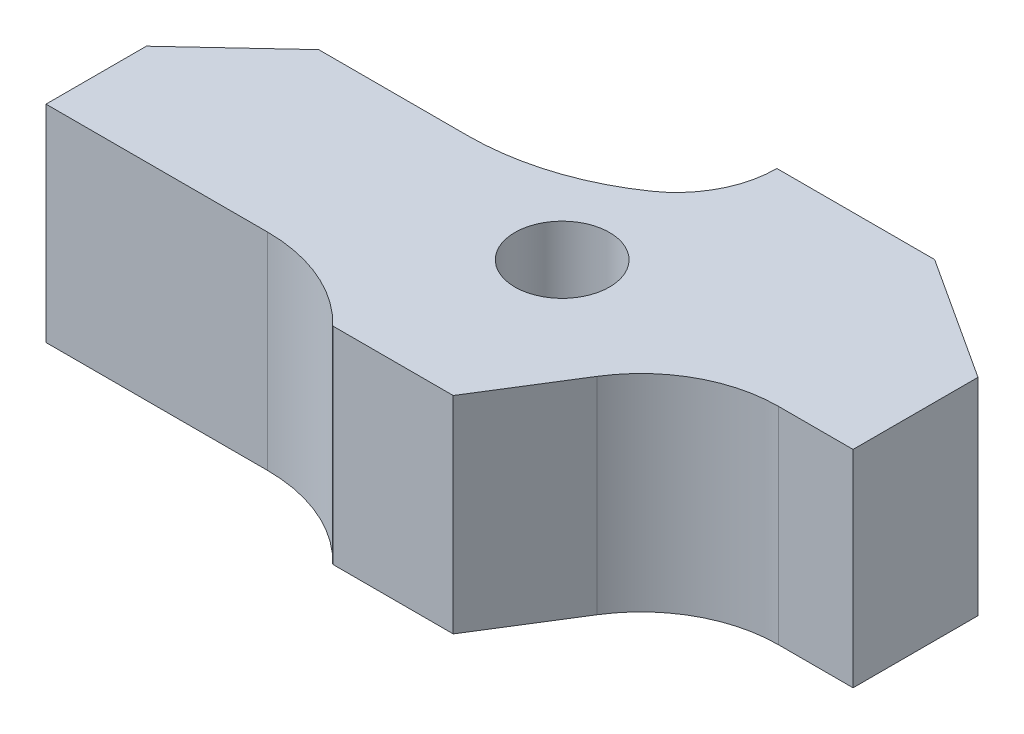
ISO-10303-21;
HEADER;
FILE_DESCRIPTION(('STEP AP214'),'2;1');
FILE_NAME('part.step','',(''),(''),'','','');
FILE_SCHEMA(('AUTOMOTIVE_DESIGN { 1 0 10303 214 1 1 1 1 }'));
ENDSEC;
DATA;
#1=APPLICATION_CONTEXT('core data for automotive mechanical design processes');
#2=APPLICATION_PROTOCOL_DEFINITION('international standard','automotive_design',2000,#1);
#3=PRODUCT_CONTEXT('',#1,'mechanical');
#4=PRODUCT('Part','Part','',(#3));
#5=PRODUCT_RELATED_PRODUCT_CATEGORY('part','',(#4));
#6=PRODUCT_DEFINITION_FORMATION('','',#4);
#7=PRODUCT_DEFINITION_CONTEXT('part definition',#1,'design');
#8=PRODUCT_DEFINITION('design','',#6,#7);
#9=PRODUCT_DEFINITION_SHAPE('','',#8);
#10=(LENGTH_UNIT() NAMED_UNIT(*) SI_UNIT(.MILLI.,.METRE.));
#11=(NAMED_UNIT(*) PLANE_ANGLE_UNIT() SI_UNIT($,.RADIAN.));
#12=(NAMED_UNIT(*) SI_UNIT($,.STERADIAN.) SOLID_ANGLE_UNIT());
#13=UNCERTAINTY_MEASURE_WITH_UNIT(LENGTH_MEASURE(1.E-05),#10,'distance_accuracy_value','');
#14=(GEOMETRIC_REPRESENTATION_CONTEXT(3) GLOBAL_UNCERTAINTY_ASSIGNED_CONTEXT((#13)) GLOBAL_UNIT_ASSIGNED_CONTEXT((#10,
#11,#12)) REPRESENTATION_CONTEXT('',''));
#15=CARTESIAN_POINT('',(0.,0.,0.));
#16=DIRECTION('',(0.,0.,1.));
#17=DIRECTION('',(1.,0.,0.));
#18=AXIS2_PLACEMENT_3D('',#15,#16,#17);
#19=CARTESIAN_POINT('',(82.9999999999999,72.,-149.848489201005));
#20=DIRECTION('',(0.,-1.,0.));
#21=DIRECTION('',(0.,0.,-1.));
#22=AXIS2_PLACEMENT_3D('',#19,#20,#21);
#23=CYLINDRICAL_SURFACE('',#22,85.8484892010049);
#24=CARTESIAN_POINT('',(82.9999999999999,0.,-149.848489201005));
#25=DIRECTION('',(0.,1.,0.));
#26=DIRECTION('',(0.,0.,1.));
#27=AXIS2_PLACEMENT_3D('',#24,#25,#26);
#28=CIRCLE('',#27,85.8484892010049);
#29=CARTESIAN_POINT('',(83.,0.,-64.));
#30=VERTEX_POINT('',#29);
#31=CARTESIAN_POINT('',(131.765046933711,0.,-79.1948743207452));
#32=VERTEX_POINT('',#31);
#33=EDGE_CURVE('E177',#30,#32,#28,.T.);
#34=ORIENTED_EDGE('',*,*,#33,.F.);
#35=DIRECTION('',(0.,-1.,0.));
#36=VECTOR('',#35,1.);
#37=CARTESIAN_POINT('',(83.,72.,-64.));
#38=LINE('',#37,#36);
#39=CARTESIAN_POINT('',(83.,72.,-64.));
#40=VERTEX_POINT('',#39);
#41=EDGE_CURVE('E11',#40,#30,#38,.T.);
#42=ORIENTED_EDGE('',*,*,#41,.F.);
#43=CARTESIAN_POINT('',(82.9999999999999,72.,-149.848489201005));
#44=DIRECTION('',(0.,1.,0.));
#45=DIRECTION('',(0.,0.,1.));
#46=AXIS2_PLACEMENT_3D('',#43,#44,#45);
#47=CIRCLE('',#46,85.8484892010049);
#48=CARTESIAN_POINT('',(131.765046933711,72.,-79.1948743207452));
#49=VERTEX_POINT('',#48);
#50=EDGE_CURVE('E218',#40,#49,#47,.T.);
#51=ORIENTED_EDGE('',*,*,#50,.T.);
#52=DIRECTION('',(0.,-1.,0.));
#53=VECTOR('',#52,1.);
#54=CARTESIAN_POINT('',(131.765046933711,72.,-79.1948743207452));
#55=LINE('',#54,#53);
#56=EDGE_CURVE('E59',#49,#32,#55,.T.);
#57=ORIENTED_EDGE('',*,*,#56,.T.);
#58=EDGE_LOOP('',(#34,#42,#51,#57));
#59=FACE_BOUND('',#58,.T.);
#60=ADVANCED_FACE('F43',(#59),#23,.F.);
#61=CARTESIAN_POINT('',(0.,72.,-64.));
#62=DIRECTION('',(0.,0.,1.));
#63=DIRECTION('',(1.,0.,0.));
#64=AXIS2_PLACEMENT_3D('',#61,#62,#63);
#65=PLANE('',#64);
#66=DIRECTION('',(-1.,0.,0.));
#67=VECTOR('',#66,1.);
#68=CARTESIAN_POINT('',(0.,0.,-64.));
#69=LINE('',#68,#67);
#70=CARTESIAN_POINT('',(31.0986925907159,0.,-64.));
#71=VERTEX_POINT('',#70);
#72=EDGE_CURVE('E179',#30,#71,#69,.T.);
#73=ORIENTED_EDGE('',*,*,#72,.T.);
#74=DIRECTION('',(0.,-1.,0.));
#75=VECTOR('',#74,1.);
#76=CARTESIAN_POINT('',(31.0986925907159,72.,-64.));
#77=LINE('',#76,#75);
#78=CARTESIAN_POINT('',(31.0986925907159,72.,-64.));
#79=VERTEX_POINT('',#78);
#80=EDGE_CURVE('E51',#79,#71,#77,.T.);
#81=ORIENTED_EDGE('',*,*,#80,.F.);
#82=DIRECTION('',(-1.,0.,0.));
#83=VECTOR('',#82,1.);
#84=CARTESIAN_POINT('',(0.,72.,-64.));
#85=LINE('',#84,#83);
#86=EDGE_CURVE('E259',#40,#79,#85,.T.);
#87=ORIENTED_EDGE('',*,*,#86,.F.);
#88=ORIENTED_EDGE('',*,*,#41,.T.);
#89=EDGE_LOOP('',(#73,#81,#87,#88));
#90=FACE_BOUND('',#89,.T.);
#91=ADVANCED_FACE('F246',(#90),#65,.F.);
#92=CARTESIAN_POINT('',(-17.4573708795469,72.,-18.7207382905222));
#93=DIRECTION('',(-0.681998360062497,0.,-0.731353701619171));
#94=DIRECTION('',(-0.731353701619172,0.,0.681998360062497));
#95=AXIS2_PLACEMENT_3D('',#92,#93,#94);
#96=PLANE('',#95);
#97=DIRECTION('',(0.731353701619171,0.,-0.681998360062497));
#98=VECTOR('',#97,1.);
#99=CARTESIAN_POINT('',(-17.4573708795469,0.,-18.7207382905222));
#100=LINE('',#99,#98);
#101=CARTESIAN_POINT('',(0.,0.,-35.));
#102=VERTEX_POINT('',#101);
#103=EDGE_CURVE('E182',#102,#71,#100,.T.);
#104=ORIENTED_EDGE('',*,*,#103,.F.);
#105=DIRECTION('',(0.,-1.,0.));
#106=VECTOR('',#105,1.);
#107=CARTESIAN_POINT('',(0.,72.,-35.));
#108=LINE('',#107,#106);
#109=CARTESIAN_POINT('',(0.,72.,-35.));
#110=VERTEX_POINT('',#109);
#111=EDGE_CURVE('E236',#110,#102,#108,.T.);
#112=ORIENTED_EDGE('',*,*,#111,.F.);
#113=DIRECTION('',(0.731353701619171,0.,-0.681998360062497));
#114=VECTOR('',#113,1.);
#115=CARTESIAN_POINT('',(-17.4573708795469,72.,-18.7207382905222));
#116=LINE('',#115,#114);
#117=EDGE_CURVE('E243',#110,#79,#116,.T.);
#118=ORIENTED_EDGE('',*,*,#117,.T.);
#119=ORIENTED_EDGE('',*,*,#80,.T.);
#120=EDGE_LOOP('',(#104,#112,#118,#119));
#121=FACE_BOUND('',#120,.T.);
#122=ADVANCED_FACE('F241',(#121),#96,.T.);
#123=CARTESIAN_POINT('',(0.,72.,0.));
#124=DIRECTION('',(-1.,0.,0.));
#125=DIRECTION('',(0.,0.,1.));
#126=AXIS2_PLACEMENT_3D('',#123,#124,#125);
#127=PLANE('',#126);
#128=DIRECTION('',(0.,0.,-1.));
#129=VECTOR('',#128,1.);
#130=CARTESIAN_POINT('',(0.,0.,0.));
#131=LINE('',#130,#129);
#132=CARTESIAN_POINT('',(0.,0.,0.));
#133=VERTEX_POINT('',#132);
#134=EDGE_CURVE('E185',#133,#102,#131,.T.);
#135=ORIENTED_EDGE('',*,*,#134,.F.);
#136=DIRECTION('',(0.,-1.,0.));
#137=VECTOR('',#136,1.);
#138=CARTESIAN_POINT('',(0.,72.,0.));
#139=LINE('',#138,#137);
#140=CARTESIAN_POINT('',(0.,72.,0.));
#141=VERTEX_POINT('',#140);
#142=EDGE_CURVE('E234',#141,#133,#139,.T.);
#143=ORIENTED_EDGE('',*,*,#142,.F.);
#144=DIRECTION('',(0.,0.,-1.));
#145=VECTOR('',#144,1.);
#146=CARTESIAN_POINT('',(0.,72.,0.));
#147=LINE('',#146,#145);
#148=EDGE_CURVE('E256',#141,#110,#147,.T.);
#149=ORIENTED_EDGE('',*,*,#148,.T.);
#150=ORIENTED_EDGE('',*,*,#111,.T.);
#151=EDGE_LOOP('',(#135,#143,#149,#150));
#152=FACE_BOUND('',#151,.T.);
#153=ADVANCED_FACE('F253',(#152),#127,.T.);
#154=CARTESIAN_POINT('',(0.,72.,0.));
#155=DIRECTION('',(0.,0.,1.));
#156=DIRECTION('',(1.,0.,0.));
#157=AXIS2_PLACEMENT_3D('',#154,#155,#156);
#158=PLANE('',#157);
#159=DIRECTION('',(-1.,0.,0.));
#160=VECTOR('',#159,1.);
#161=CARTESIAN_POINT('',(0.,0.,0.));
#162=LINE('',#161,#160);
#163=CARTESIAN_POINT('',(77.2382092958579,0.,0.));
#164=VERTEX_POINT('',#163);
#165=EDGE_CURVE('E188',#164,#133,#162,.T.);
#166=ORIENTED_EDGE('',*,*,#165,.F.);
#167=DIRECTION('',(0.,-1.,0.));
#168=VECTOR('',#167,1.);
#169=CARTESIAN_POINT('',(77.2382092958579,72.,0.));
#170=LINE('',#169,#168);
#171=CARTESIAN_POINT('',(77.2382092958579,72.,0.));
#172=VERTEX_POINT('',#171);
#173=EDGE_CURVE('E232',#172,#164,#170,.T.);
#174=ORIENTED_EDGE('',*,*,#173,.F.);
#175=DIRECTION('',(-1.,0.,0.));
#176=VECTOR('',#175,1.);
#177=CARTESIAN_POINT('',(0.,72.,0.));
#178=LINE('',#177,#176);
#179=EDGE_CURVE('E261',#172,#141,#178,.T.);
#180=ORIENTED_EDGE('',*,*,#179,.T.);
#181=ORIENTED_EDGE('',*,*,#142,.T.);
#182=EDGE_LOOP('',(#166,#174,#180,#181));
#183=FACE_BOUND('',#182,.T.);
#184=ADVANCED_FACE('F307',(#183),#158,.T.);
#185=CARTESIAN_POINT('',(77.2382092958579,72.,55.0000000000001));
#186=DIRECTION('',(0.,-1.,0.));
#187=DIRECTION('',(0.,0.,-1.));
#188=AXIS2_PLACEMENT_3D('',#185,#186,#187);
#189=CYLINDRICAL_SURFACE('',#188,55.0000000000001);
#190=CARTESIAN_POINT('',(77.2382092958579,0.,55.0000000000001));
#191=DIRECTION('',(0.,1.,0.));
#192=DIRECTION('',(0.,0.,1.));
#193=AXIS2_PLACEMENT_3D('',#190,#191,#192);
#194=CIRCLE('',#193,55.0000000000001);
#195=CARTESIAN_POINT('',(117.,0.,17.));
#196=VERTEX_POINT('',#195);
#197=EDGE_CURVE('E191',#196,#164,#194,.T.);
#198=ORIENTED_EDGE('',*,*,#197,.F.);
#199=DIRECTION('',(0.,-1.,0.));
#200=VECTOR('',#199,1.);
#201=CARTESIAN_POINT('',(117.,72.,17.));
#202=LINE('',#201,#200);
#203=CARTESIAN_POINT('',(117.,72.,17.));
#204=VERTEX_POINT('',#203);
#205=EDGE_CURVE('E230',#204,#196,#202,.T.);
#206=ORIENTED_EDGE('',*,*,#205,.F.);
#207=CARTESIAN_POINT('',(77.2382092958579,72.,55.0000000000001));
#208=DIRECTION('',(0.,1.,0.));
#209=DIRECTION('',(0.,0.,1.));
#210=AXIS2_PLACEMENT_3D('',#207,#208,#209);
#211=CIRCLE('',#210,55.0000000000001);
#212=EDGE_CURVE('E267',#204,#172,#211,.T.);
#213=ORIENTED_EDGE('',*,*,#212,.T.);
#214=ORIENTED_EDGE('',*,*,#173,.T.);
#215=EDGE_LOOP('',(#198,#206,#213,#214));
#216=FACE_BOUND('',#215,.T.);
#217=ADVANCED_FACE('F310',(#216),#189,.F.);
#218=CARTESIAN_POINT('',(0.,72.,17.));
#219=DIRECTION('',(0.,0.,1.));
#220=DIRECTION('',(1.,0.,0.));
#221=AXIS2_PLACEMENT_3D('',#218,#219,#220);
#222=PLANE('',#221);
#223=DIRECTION('',(-1.,0.,0.));
#224=VECTOR('',#223,1.);
#225=CARTESIAN_POINT('',(0.,0.,17.));
#226=LINE('',#225,#224);
#227=CARTESIAN_POINT('',(159.,0.,17.));
#228=VERTEX_POINT('',#227);
#229=EDGE_CURVE('E194',#228,#196,#226,.T.);
#230=ORIENTED_EDGE('',*,*,#229,.F.);
#231=DIRECTION('',(0.,-1.,0.));
#232=VECTOR('',#231,1.);
#233=CARTESIAN_POINT('',(159.,72.,17.));
#234=LINE('',#233,#232);
#235=CARTESIAN_POINT('',(159.,72.,17.));
#236=VERTEX_POINT('',#235);
#237=EDGE_CURVE('E228',#236,#228,#234,.T.);
#238=ORIENTED_EDGE('',*,*,#237,.F.);
#239=DIRECTION('',(-1.,0.,0.));
#240=VECTOR('',#239,1.);
#241=CARTESIAN_POINT('',(0.,72.,17.));
#242=LINE('',#241,#240);
#243=EDGE_CURVE('E270',#236,#204,#242,.T.);
#244=ORIENTED_EDGE('',*,*,#243,.T.);
#245=ORIENTED_EDGE('',*,*,#205,.T.);
#246=EDGE_LOOP('',(#230,#238,#244,#245));
#247=FACE_BOUND('',#246,.T.);
#248=ADVANCED_FACE('F314',(#247),#222,.T.);
#249=CARTESIAN_POINT('',(121.990255563273,72.,76.2279719330776));
#250=DIRECTION('',(0.84804809615642,0.,0.529919264233214));
#251=DIRECTION('',(0.529919264233214,0.,-0.84804809615642));
#252=AXIS2_PLACEMENT_3D('',#249,#250,#251);
#253=PLANE('',#252);
#254=DIRECTION('',(-0.529919264233214,0.,0.84804809615642));
#255=VECTOR('',#254,1.);
#256=CARTESIAN_POINT('',(121.990255563273,0.,76.2279719330776));
#257=LINE('',#256,#255);
#258=CARTESIAN_POINT('',(178.293691384492,0.,-13.8763605152636));
#259=VERTEX_POINT('',#258);
#260=EDGE_CURVE('E197',#259,#228,#257,.T.);
#261=ORIENTED_EDGE('',*,*,#260,.F.);
#262=DIRECTION('',(0.,-1.,0.));
#263=VECTOR('',#262,1.);
#264=CARTESIAN_POINT('',(178.293691384492,72.,-13.8763605152636));
#265=LINE('',#264,#263);
#266=CARTESIAN_POINT('',(178.293691384492,72.,-13.8763605152636));
#267=VERTEX_POINT('',#266);
#268=EDGE_CURVE('E226',#267,#259,#265,.T.);
#269=ORIENTED_EDGE('',*,*,#268,.F.);
#270=DIRECTION('',(-0.529919264233214,0.,0.84804809615642));
#271=VECTOR('',#270,1.);
#272=CARTESIAN_POINT('',(121.990255563273,72.,76.2279719330776));
#273=LINE('',#272,#271);
#274=EDGE_CURVE('E273',#267,#236,#273,.T.);
#275=ORIENTED_EDGE('',*,*,#274,.T.);
#276=ORIENTED_EDGE('',*,*,#237,.T.);
#277=EDGE_LOOP('',(#261,#269,#275,#276));
#278=FACE_BOUND('',#277,.T.);
#279=ADVANCED_FACE('F318',(#278),#253,.T.);
#280=CARTESIAN_POINT('',(219.,72.,11.5597641679305));
#281=DIRECTION('',(0.,-1.,0.));
#282=DIRECTION('',(0.,0.,-1.));
#283=AXIS2_PLACEMENT_3D('',#280,#281,#282);
#284=CYLINDRICAL_SURFACE('',#283,47.9999999999998);
#285=CARTESIAN_POINT('',(219.,0.,11.5597641679305));
#286=DIRECTION('',(0.,1.,0.));
#287=DIRECTION('',(0.,0.,1.));
#288=AXIS2_PLACEMENT_3D('',#285,#286,#287);
#289=CIRCLE('',#288,47.9999999999998);
#290=CARTESIAN_POINT('',(219.,0.,-36.4402358320692));
#291=VERTEX_POINT('',#290);
#292=EDGE_CURVE('E200',#291,#259,#289,.T.);
#293=ORIENTED_EDGE('',*,*,#292,.F.);
#294=DIRECTION('',(0.,-1.,0.));
#295=VECTOR('',#294,1.);
#296=CARTESIAN_POINT('',(219.,72.,-36.4402358320692));
#297=LINE('',#296,#295);
#298=CARTESIAN_POINT('',(219.,72.,-36.4402358320692));
#299=VERTEX_POINT('',#298);
#300=EDGE_CURVE('E224',#299,#291,#297,.T.);
#301=ORIENTED_EDGE('',*,*,#300,.F.);
#302=CARTESIAN_POINT('',(219.,72.,11.5597641679305));
#303=DIRECTION('',(0.,1.,0.));
#304=DIRECTION('',(0.,0.,1.));
#305=AXIS2_PLACEMENT_3D('',#302,#303,#304);
#306=CIRCLE('',#305,47.9999999999998);
#307=EDGE_CURVE('E276',#299,#267,#306,.T.);
#308=ORIENTED_EDGE('',*,*,#307,.T.);
#309=ORIENTED_EDGE('',*,*,#268,.T.);
#310=EDGE_LOOP('',(#293,#301,#308,#309));
#311=FACE_BOUND('',#310,.T.);
#312=ADVANCED_FACE('F322',(#311),#284,.F.);
#313=CARTESIAN_POINT('',(0.,72.,-36.4402358320692));
#314=DIRECTION('',(0.,0.,1.));
#315=DIRECTION('',(1.,0.,0.));
#316=AXIS2_PLACEMENT_3D('',#313,#314,#315);
#317=PLANE('',#316);
#318=DIRECTION('',(-1.,0.,0.));
#319=VECTOR('',#318,1.);
#320=CARTESIAN_POINT('',(0.,0.,-36.4402358320692));
#321=LINE('',#320,#319);
#322=CARTESIAN_POINT('',(245.,0.,-36.4402358320692));
#323=VERTEX_POINT('',#322);
#324=EDGE_CURVE('E203',#323,#291,#321,.T.);
#325=ORIENTED_EDGE('',*,*,#324,.F.);
#326=DIRECTION('',(0.,-1.,0.));
#327=VECTOR('',#326,1.);
#328=CARTESIAN_POINT('',(245.,72.,-36.4402358320692));
#329=LINE('',#328,#327);
#330=CARTESIAN_POINT('',(245.,72.,-36.4402358320692));
#331=VERTEX_POINT('',#330);
#332=EDGE_CURVE('E222',#331,#323,#329,.T.);
#333=ORIENTED_EDGE('',*,*,#332,.F.);
#334=DIRECTION('',(-1.,0.,0.));
#335=VECTOR('',#334,1.);
#336=CARTESIAN_POINT('',(0.,72.,-36.4402358320692));
#337=LINE('',#336,#335);
#338=EDGE_CURVE('E279',#331,#299,#337,.T.);
#339=ORIENTED_EDGE('',*,*,#338,.T.);
#340=ORIENTED_EDGE('',*,*,#300,.T.);
#341=EDGE_LOOP('',(#325,#333,#339,#340));
#342=FACE_BOUND('',#341,.T.);
#343=ADVANCED_FACE('F326',(#342),#317,.T.);
#344=CARTESIAN_POINT('',(245.,72.,0.));
#345=DIRECTION('',(1.,0.,0.));
#346=DIRECTION('',(0.,0.,-1.));
#347=AXIS2_PLACEMENT_3D('',#344,#345,#346);
#348=PLANE('',#347);
#349=DIRECTION('',(0.,0.,1.));
#350=VECTOR('',#349,1.);
#351=CARTESIAN_POINT('',(245.,0.,0.));
#352=LINE('',#351,#350);
#353=CARTESIAN_POINT('',(245.,0.,-80.));
#354=VERTEX_POINT('',#353);
#355=EDGE_CURVE('E206',#354,#323,#352,.T.);
#356=ORIENTED_EDGE('',*,*,#355,.F.);
#357=DIRECTION('',(0.,-1.,0.));
#358=VECTOR('',#357,1.);
#359=CARTESIAN_POINT('',(245.,72.,-80.));
#360=LINE('',#359,#358);
#361=CARTESIAN_POINT('',(245.,72.,-80.));
#362=VERTEX_POINT('',#361);
#363=EDGE_CURVE('E154',#362,#354,#360,.T.);
#364=ORIENTED_EDGE('',*,*,#363,.F.);
#365=DIRECTION('',(0.,0.,1.));
#366=VECTOR('',#365,1.);
#367=CARTESIAN_POINT('',(245.,72.,0.));
#368=LINE('',#367,#366);
#369=EDGE_CURVE('E166',#362,#331,#368,.T.);
#370=ORIENTED_EDGE('',*,*,#369,.T.);
#371=ORIENTED_EDGE('',*,*,#332,.T.);
#372=EDGE_LOOP('',(#356,#364,#370,#371));
#373=FACE_BOUND('',#372,.T.);
#374=ADVANCED_FACE('F283',(#373),#348,.T.);
#375=CARTESIAN_POINT('',(109.216579528921,72.,-168.178784284251));
#376=DIRECTION('',(0.544639035015037,0.,-0.838670567945418));
#377=DIRECTION('',(-0.838670567945418,0.,-0.544639035015037));
#378=AXIS2_PLACEMENT_3D('',#375,#376,#377);
#379=PLANE('',#378);
#380=DIRECTION('',(0.838670567945418,0.,0.544639035015037));
#381=VECTOR('',#380,1.);
#382=CARTESIAN_POINT('',(109.216579528921,0.,-168.178784284251));
#383=LINE('',#382,#381);
#384=CARTESIAN_POINT('',(201.883781013193,0.,-108.));
#385=VERTEX_POINT('',#384);
#386=EDGE_CURVE('E150',#385,#354,#383,.T.);
#387=ORIENTED_EDGE('',*,*,#386,.F.);
#388=DIRECTION('',(0.,-1.,0.));
#389=VECTOR('',#388,1.);
#390=CARTESIAN_POINT('',(201.883781013193,72.,-108.));
#391=LINE('',#390,#389);
#392=CARTESIAN_POINT('',(201.883781013193,72.,-108.));
#393=VERTEX_POINT('',#392);
#394=EDGE_CURVE('E145',#393,#385,#391,.T.);
#395=ORIENTED_EDGE('',*,*,#394,.F.);
#396=DIRECTION('',(0.838670567945418,0.,0.544639035015037));
#397=VECTOR('',#396,1.);
#398=CARTESIAN_POINT('',(109.216579528921,72.,-168.178784284251));
#399=LINE('',#398,#397);
#400=EDGE_CURVE('E148',#393,#362,#399,.T.);
#401=ORIENTED_EDGE('',*,*,#400,.T.);
#402=ORIENTED_EDGE('',*,*,#363,.T.);
#403=EDGE_LOOP('',(#387,#395,#401,#402));
#404=FACE_BOUND('',#403,.T.);
#405=ADVANCED_FACE('F147',(#404),#379,.T.);
#406=CARTESIAN_POINT('',(0.,72.,-108.));
#407=DIRECTION('',(0.,0.,-1.));
#408=DIRECTION('',(-1.,0.,0.));
#409=AXIS2_PLACEMENT_3D('',#406,#407,#408);
#410=PLANE('',#409);
#411=DIRECTION('',(1.,0.,0.));
#412=VECTOR('',#411,1.);
#413=CARTESIAN_POINT('',(0.,0.,-108.));
#414=LINE('',#413,#412);
#415=CARTESIAN_POINT('',(146.883781013193,0.,-108.));
#416=VERTEX_POINT('',#415);
#417=EDGE_CURVE('E210',#416,#385,#414,.T.);
#418=ORIENTED_EDGE('',*,*,#417,.F.);
#419=DIRECTION('',(0.,-1.,0.));
#420=VECTOR('',#419,1.);
#421=CARTESIAN_POINT('',(146.883781013193,72.,-108.));
#422=LINE('',#421,#420);
#423=CARTESIAN_POINT('',(146.883781013193,72.,-108.));
#424=VERTEX_POINT('',#423);
#425=EDGE_CURVE('E102',#424,#416,#422,.T.);
#426=ORIENTED_EDGE('',*,*,#425,.F.);
#427=DIRECTION('',(1.,0.,0.));
#428=VECTOR('',#427,1.);
#429=CARTESIAN_POINT('',(0.,72.,-108.));
#430=LINE('',#429,#428);
#431=EDGE_CURVE('E163',#424,#393,#430,.T.);
#432=ORIENTED_EDGE('',*,*,#431,.T.);
#433=ORIENTED_EDGE('',*,*,#394,.T.);
#434=EDGE_LOOP('',(#418,#426,#432,#433));
#435=FACE_BOUND('',#434,.T.);
#436=ADVANCED_FACE('F168',(#435),#410,.T.);
#437=CARTESIAN_POINT('',(111.883781013193,72.,-108.));
#438=DIRECTION('',(0.,-1.,0.));
#439=DIRECTION('',(0.,0.,-1.));
#440=AXIS2_PLACEMENT_3D('',#437,#438,#439);
#441=CYLINDRICAL_SURFACE('',#440,35.);
#442=CARTESIAN_POINT('',(111.883781013193,0.,-108.));
#443=DIRECTION('',(0.,1.,0.));
#444=DIRECTION('',(0.,0.,1.));
#445=AXIS2_PLACEMENT_3D('',#442,#443,#444);
#446=CIRCLE('',#445,35.);
#447=EDGE_CURVE('E212',#32,#416,#446,.T.);
#448=ORIENTED_EDGE('',*,*,#447,.F.);
#449=ORIENTED_EDGE('',*,*,#56,.F.);
#450=CARTESIAN_POINT('',(111.883781013193,72.,-108.));
#451=DIRECTION('',(0.,1.,0.));
#452=DIRECTION('',(0.,0.,1.));
#453=AXIS2_PLACEMENT_3D('',#450,#451,#452);
#454=CIRCLE('',#453,35.);
#455=EDGE_CURVE('E169',#49,#424,#454,.T.);
#456=ORIENTED_EDGE('',*,*,#455,.T.);
#457=ORIENTED_EDGE('',*,*,#425,.T.);
#458=EDGE_LOOP('',(#448,#449,#456,#457));
#459=FACE_BOUND('',#458,.T.);
#460=ADVANCED_FACE('F285',(#459),#441,.F.);
#461=CARTESIAN_POINT('',(137.,72.,-43.));
#462=DIRECTION('',(0.,-1.,0.));
#463=DIRECTION('',(0.,0.,-1.));
#464=AXIS2_PLACEMENT_3D('',#461,#462,#463);
#465=CYLINDRICAL_SURFACE('',#464,16.5);
#466=CARTESIAN_POINT('',(137.,72.,-43.));
#467=DIRECTION('',(0.,1.,0.));
#468=DIRECTION('',(0.,0.,1.));
#469=AXIS2_PLACEMENT_3D('',#466,#467,#468);
#470=CIRCLE('',#469,16.5);
#471=CARTESIAN_POINT('',(137.,72.,-26.5));
#472=VERTEX_POINT('',#471);
#473=EDGE_CURVE('E171',#472,#472,#470,.T.);
#474=ORIENTED_EDGE('',*,*,#473,.T.);
#475=EDGE_LOOP('',(#474));
#476=FACE_BOUND('',#475,.T.);
#477=CARTESIAN_POINT('',(137.,0.,-43.));
#478=DIRECTION('',(0.,1.,0.));
#479=DIRECTION('',(0.,0.,1.));
#480=AXIS2_PLACEMENT_3D('',#477,#478,#479);
#481=CIRCLE('',#480,16.5);
#482=CARTESIAN_POINT('',(137.,0.,-26.5));
#483=VERTEX_POINT('',#482);
#484=EDGE_CURVE('E215',#483,#483,#481,.T.);
#485=ORIENTED_EDGE('',*,*,#484,.F.);
#486=EDGE_LOOP('',(#485));
#487=FACE_BOUND('',#486,.T.);
#488=ADVANCED_FACE('F287',(#476,#487),#465,.F.);
#489=CARTESIAN_POINT('',(0.,72.,0.));
#490=DIRECTION('',(0.,1.,0.));
#491=DIRECTION('',(0.,0.,1.));
#492=AXIS2_PLACEMENT_3D('',#489,#490,#491);
#493=PLANE('',#492);
#494=ORIENTED_EDGE('',*,*,#50,.F.);
#495=ORIENTED_EDGE('',*,*,#86,.T.);
#496=ORIENTED_EDGE('',*,*,#117,.F.);
#497=ORIENTED_EDGE('',*,*,#148,.F.);
#498=ORIENTED_EDGE('',*,*,#179,.F.);
#499=ORIENTED_EDGE('',*,*,#212,.F.);
#500=ORIENTED_EDGE('',*,*,#243,.F.);
#501=ORIENTED_EDGE('',*,*,#274,.F.);
#502=ORIENTED_EDGE('',*,*,#307,.F.);
#503=ORIENTED_EDGE('',*,*,#338,.F.);
#504=ORIENTED_EDGE('',*,*,#369,.F.);
#505=ORIENTED_EDGE('',*,*,#400,.F.);
#506=ORIENTED_EDGE('',*,*,#431,.F.);
#507=ORIENTED_EDGE('',*,*,#455,.F.);
#508=EDGE_LOOP('',(#494,#495,#496,#497,#498,#499,#500,#501,#502,#503,#504,#505,#506,#507));
#509=FACE_BOUND('',#508,.T.);
#510=ORIENTED_EDGE('',*,*,#473,.F.);
#511=EDGE_LOOP('',(#510));
#512=FACE_BOUND('',#511,.T.);
#513=ADVANCED_FACE('F160',(#509,#512),#493,.T.);
#514=CARTESIAN_POINT('',(0.,0.,0.));
#515=DIRECTION('',(0.,1.,0.));
#516=DIRECTION('',(0.,0.,1.));
#517=AXIS2_PLACEMENT_3D('',#514,#515,#516);
#518=PLANE('',#517);
#519=ORIENTED_EDGE('',*,*,#33,.T.);
#520=ORIENTED_EDGE('',*,*,#447,.T.);
#521=ORIENTED_EDGE('',*,*,#417,.T.);
#522=ORIENTED_EDGE('',*,*,#386,.T.);
#523=ORIENTED_EDGE('',*,*,#355,.T.);
#524=ORIENTED_EDGE('',*,*,#324,.T.);
#525=ORIENTED_EDGE('',*,*,#292,.T.);
#526=ORIENTED_EDGE('',*,*,#260,.T.);
#527=ORIENTED_EDGE('',*,*,#229,.T.);
#528=ORIENTED_EDGE('',*,*,#197,.T.);
#529=ORIENTED_EDGE('',*,*,#165,.T.);
#530=ORIENTED_EDGE('',*,*,#134,.T.);
#531=ORIENTED_EDGE('',*,*,#103,.T.);
#532=ORIENTED_EDGE('',*,*,#72,.F.);
#533=EDGE_LOOP('',(#519,#520,#521,#522,#523,#524,#525,#526,#527,#528,#529,#530,#531,#532));
#534=FACE_BOUND('',#533,.T.);
#535=ORIENTED_EDGE('',*,*,#484,.T.);
#536=EDGE_LOOP('',(#535));
#537=FACE_BOUND('',#536,.T.);
#538=ADVANCED_FACE('F248',(#534,#537),#518,.F.);
#539=CLOSED_SHELL('',(#60,#91,#122,#153,#184,#217,#248,#279,#312,#343,#374,#405,#436,#460,#488,
#513,#538));
#540=MANIFOLD_SOLID_BREP('B2',#539);
#541=ADVANCED_BREP_SHAPE_REPRESENTATION('',(#18,#540),#14);
#542=SHAPE_DEFINITION_REPRESENTATION(#9,#541);
ENDSEC;
END-ISO-10303-21;
